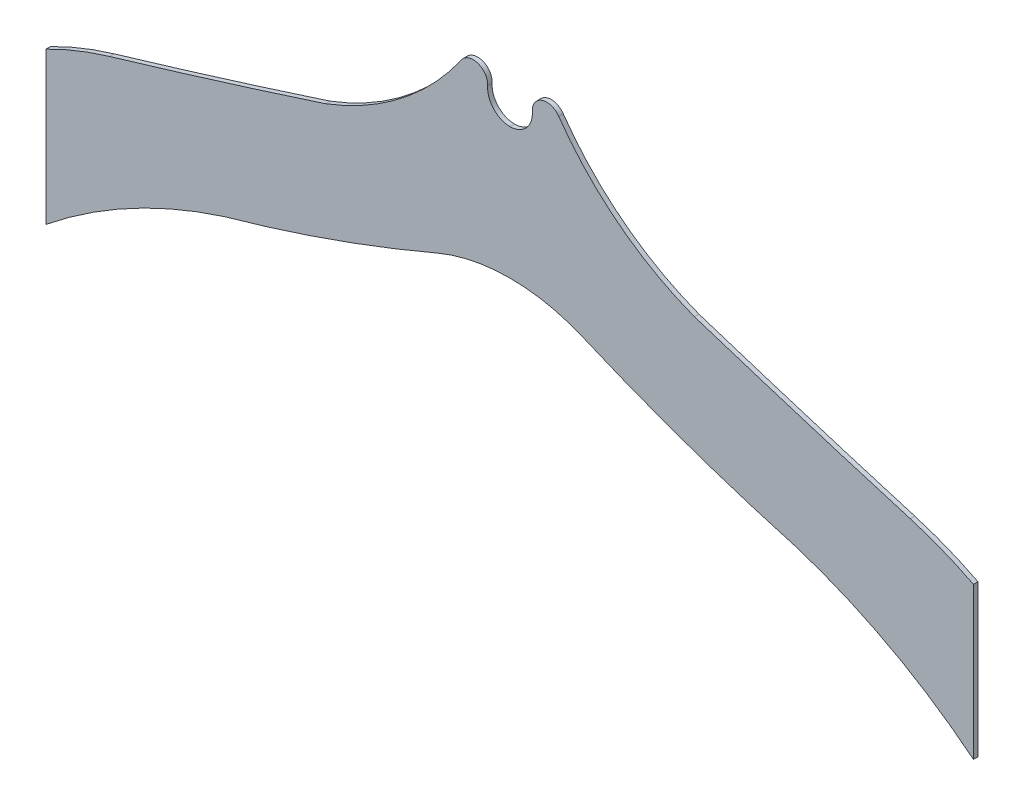
ISO-10303-21;
HEADER;
FILE_DESCRIPTION(('STEP AP214'),'2;1');
FILE_NAME('part.step','',(''),(''),'','','');
FILE_SCHEMA(('AUTOMOTIVE_DESIGN { 1 0 10303 214 1 1 1 1 }'));
ENDSEC;
DATA;
#1=APPLICATION_CONTEXT('core data for automotive mechanical design processes');
#2=APPLICATION_PROTOCOL_DEFINITION('international standard','automotive_design',2000,#1);
#3=PRODUCT_CONTEXT('',#1,'mechanical');
#4=PRODUCT('Part','Part','',(#3));
#5=PRODUCT_RELATED_PRODUCT_CATEGORY('part','',(#4));
#6=PRODUCT_DEFINITION_FORMATION('','',#4);
#7=PRODUCT_DEFINITION_CONTEXT('part definition',#1,'design');
#8=PRODUCT_DEFINITION('design','',#6,#7);
#9=PRODUCT_DEFINITION_SHAPE('','',#8);
#10=(LENGTH_UNIT() NAMED_UNIT(*) SI_UNIT(.MILLI.,.METRE.));
#11=(NAMED_UNIT(*) PLANE_ANGLE_UNIT() SI_UNIT($,.RADIAN.));
#12=(NAMED_UNIT(*) SI_UNIT($,.STERADIAN.) SOLID_ANGLE_UNIT());
#13=UNCERTAINTY_MEASURE_WITH_UNIT(LENGTH_MEASURE(1.E-05),#10,'distance_accuracy_value','');
#14=(GEOMETRIC_REPRESENTATION_CONTEXT(3) GLOBAL_UNCERTAINTY_ASSIGNED_CONTEXT((#13)) GLOBAL_UNIT_ASSIGNED_CONTEXT((#10,
#11,#12)) REPRESENTATION_CONTEXT('',''));
#15=CARTESIAN_POINT('',(0.,0.,0.));
#16=DIRECTION('',(0.,0.,1.));
#17=DIRECTION('',(1.,0.,0.));
#18=AXIS2_PLACEMENT_3D('',#15,#16,#17);
#19=CARTESIAN_POINT('',(-650.809500657787,926.892746035444,0.));
#20=DIRECTION('',(-1.,0.,0.));
#21=DIRECTION('',(0.,-1.,0.));
#22=AXIS2_PLACEMENT_3D('',#19,#20,#21);
#23=PLANE('',#22);
#24=DIRECTION('',(0.,-1.,0.));
#25=VECTOR('',#24,1.);
#26=CARTESIAN_POINT('',(-650.809500657786,-2255.82427941432,6.35));
#27=LINE('',#26,#25);
#28=CARTESIAN_POINT('',(-650.809500657786,-263.112443380629,6.35));
#29=VERTEX_POINT('',#28);
#30=CARTESIAN_POINT('',(-650.809500657786,-476.145226420373,6.35));
#31=VERTEX_POINT('',#30);
#32=EDGE_CURVE('E40',#29,#31,#27,.T.);
#33=ORIENTED_EDGE('',*,*,#32,.F.);
#34=DIRECTION('',(0.,0.,-1.));
#35=VECTOR('',#34,1.);
#36=CARTESIAN_POINT('',(-650.809500657786,-263.112443380629,6.35));
#37=LINE('',#36,#35);
#38=CARTESIAN_POINT('',(-650.809500657786,-263.112443380629,0.));
#39=VERTEX_POINT('',#38);
#40=EDGE_CURVE('E227',#29,#39,#37,.T.);
#41=ORIENTED_EDGE('',*,*,#40,.T.);
#42=DIRECTION('',(0.,-1.,0.));
#43=VECTOR('',#42,1.);
#44=CARTESIAN_POINT('',(-650.809500657786,-2255.82427941432,0.));
#45=LINE('',#44,#43);
#46=CARTESIAN_POINT('',(-650.809500657786,-476.145226420373,0.));
#47=VERTEX_POINT('',#46);
#48=EDGE_CURVE('E223',#39,#47,#45,.T.);
#49=ORIENTED_EDGE('',*,*,#48,.T.);
#50=DIRECTION('',(0.,0.,-1.));
#51=VECTOR('',#50,1.);
#52=CARTESIAN_POINT('',(-650.809500657786,-476.145226420373,6.35));
#53=LINE('',#52,#51);
#54=EDGE_CURVE('E230',#31,#47,#53,.T.);
#55=ORIENTED_EDGE('',*,*,#54,.F.);
#56=EDGE_LOOP('',(#33,#41,#49,#55));
#57=FACE_BOUND('',#56,.T.);
#58=ADVANCED_FACE('F36',(#57),#23,.T.);
#59=CARTESIAN_POINT('',(650.809500657787,926.892746035444,0.));
#60=DIRECTION('',(1.,0.,0.));
#61=DIRECTION('',(0.,-1.,0.));
#62=AXIS2_PLACEMENT_3D('',#59,#60,#61);
#63=PLANE('',#62);
#64=DIRECTION('',(0.,1.,0.));
#65=VECTOR('',#64,1.);
#66=CARTESIAN_POINT('',(650.809500657786,-2255.82427941432,0.));
#67=LINE('',#66,#65);
#68=CARTESIAN_POINT('',(650.809500657786,-475.62803001882,0.));
#69=VERTEX_POINT('',#68);
#70=CARTESIAN_POINT('',(650.809500657786,-262.784392892332,0.));
#71=VERTEX_POINT('',#70);
#72=EDGE_CURVE('E160',#69,#71,#67,.T.);
#73=ORIENTED_EDGE('',*,*,#72,.T.);
#74=DIRECTION('',(0.,0.,-1.));
#75=VECTOR('',#74,1.);
#76=CARTESIAN_POINT('',(650.809500657786,-262.784392892332,6.35));
#77=LINE('',#76,#75);
#78=CARTESIAN_POINT('',(650.809500657786,-262.784392892332,6.35));
#79=VERTEX_POINT('',#78);
#80=EDGE_CURVE('E224',#71,#79,#77,.F.);
#81=ORIENTED_EDGE('',*,*,#80,.T.);
#82=DIRECTION('',(0.,1.,0.));
#83=VECTOR('',#82,1.);
#84=CARTESIAN_POINT('',(650.809500657786,-2255.82427941432,6.35));
#85=LINE('',#84,#83);
#86=CARTESIAN_POINT('',(650.809500657786,-475.62803001882,6.35));
#87=VERTEX_POINT('',#86);
#88=EDGE_CURVE('E231',#87,#79,#85,.T.);
#89=ORIENTED_EDGE('',*,*,#88,.F.);
#90=DIRECTION('',(0.,0.,-1.));
#91=VECTOR('',#90,1.);
#92=CARTESIAN_POINT('',(650.809500657786,-475.62803001882,6.35));
#93=LINE('',#92,#91);
#94=EDGE_CURVE('E228',#69,#87,#93,.F.);
#95=ORIENTED_EDGE('',*,*,#94,.F.);
#96=EDGE_LOOP('',(#73,#81,#89,#95));
#97=FACE_BOUND('',#96,.T.);
#98=ADVANCED_FACE('F286',(#97),#63,.T.);
#99=CARTESIAN_POINT('',(-167.983659058844,-1073.95924229887,6.35));
#100=DIRECTION('',(0.,0.,-1.));
#101=DIRECTION('',(-1.,0.,0.));
#102=AXIS2_PLACEMENT_3D('',#99,#100,#101);
#103=CYLINDRICAL_SURFACE('',#102,768.441533817959);
#104=CARTESIAN_POINT('',(-167.983659058844,-1073.95924229887,6.35));
#105=DIRECTION('',(0.,0.,1.));
#106=DIRECTION('',(1.,0.,0.));
#107=AXIS2_PLACEMENT_3D('',#104,#105,#106);
#108=CIRCLE('',#107,768.441533817959);
#109=CARTESIAN_POINT('',(-400.266331752857,-341.465453340471,6.35));
#110=VERTEX_POINT('',#109);
#111=EDGE_CURVE('E208',#110,#31,#108,.T.);
#112=ORIENTED_EDGE('',*,*,#111,.T.);
#113=ORIENTED_EDGE('',*,*,#54,.T.);
#114=CARTESIAN_POINT('',(-167.983659058844,-1073.95924229887,0.));
#115=DIRECTION('',(0.,0.,1.));
#116=DIRECTION('',(1.,0.,0.));
#117=AXIS2_PLACEMENT_3D('',#114,#115,#116);
#118=CIRCLE('',#117,768.441533817959);
#119=CARTESIAN_POINT('',(-400.266331752857,-341.465453340471,0.));
#120=VERTEX_POINT('',#119);
#121=EDGE_CURVE('E164',#120,#47,#118,.T.);
#122=ORIENTED_EDGE('',*,*,#121,.F.);
#123=DIRECTION('',(0.,0.,-1.));
#124=VECTOR('',#123,1.);
#125=CARTESIAN_POINT('',(-400.266331752857,-341.465453340471,6.35));
#126=LINE('',#125,#124);
#127=EDGE_CURVE('E173',#110,#120,#126,.T.);
#128=ORIENTED_EDGE('',*,*,#127,.F.);
#129=EDGE_LOOP('',(#112,#113,#122,#128));
#130=FACE_BOUND('',#129,.T.);
#131=ADVANCED_FACE('F38',(#130),#103,.F.);
#132=CARTESIAN_POINT('',(-1045.63273530441,1969.29928635765,6.35));
#133=DIRECTION('',(0.,0.,-1.));
#134=DIRECTION('',(-1.,0.,0.));
#135=AXIS2_PLACEMENT_3D('',#132,#133,#134);
#136=CYLINDRICAL_SURFACE('',#135,2399.193922355);
#137=CARTESIAN_POINT('',(-1045.63273530441,1969.29928635765,0.));
#138=DIRECTION('',(0.,0.,1.));
#139=DIRECTION('',(1.,0.,0.));
#140=AXIS2_PLACEMENT_3D('',#137,#138,#139);
#141=CIRCLE('',#140,2399.193922355);
#142=CARTESIAN_POINT('',(-102.624962662433,-236.798584953143,0.));
#143=VERTEX_POINT('',#142);
#144=EDGE_CURVE('E179',#120,#143,#141,.T.);
#145=ORIENTED_EDGE('',*,*,#144,.T.);
#146=DIRECTION('',(0.,0.,-1.));
#147=VECTOR('',#146,1.);
#148=CARTESIAN_POINT('',(-102.624962662433,-236.798584953143,6.35));
#149=LINE('',#148,#147);
#150=CARTESIAN_POINT('',(-102.624962662433,-236.798584953143,6.35));
#151=VERTEX_POINT('',#150);
#152=EDGE_CURVE('E186',#151,#143,#149,.T.);
#153=ORIENTED_EDGE('',*,*,#152,.F.);
#154=CARTESIAN_POINT('',(-1045.63273530441,1969.29928635765,6.35));
#155=DIRECTION('',(0.,0.,1.));
#156=DIRECTION('',(1.,0.,0.));
#157=AXIS2_PLACEMENT_3D('',#154,#155,#156);
#158=CIRCLE('',#157,2399.193922355);
#159=EDGE_CURVE('E206',#110,#151,#158,.T.);
#160=ORIENTED_EDGE('',*,*,#159,.F.);
#161=ORIENTED_EDGE('',*,*,#127,.T.);
#162=EDGE_LOOP('',(#145,#153,#160,#161));
#163=FACE_BOUND('',#162,.T.);
#164=ADVANCED_FACE('F273',(#163),#136,.T.);
#165=CARTESIAN_POINT('',(-0.149571003863258,-476.53228594708,6.35));
#166=DIRECTION('',(0.,0.,-1.));
#167=DIRECTION('',(-1.,0.,0.));
#168=AXIS2_PLACEMENT_3D('',#165,#166,#167);
#169=CYLINDRICAL_SURFACE('',#168,260.717190242277);
#170=CARTESIAN_POINT('',(-0.149571003863258,-476.53228594708,0.));
#171=DIRECTION('',(0.,0.,1.));
#172=DIRECTION('',(1.,0.,0.));
#173=AXIS2_PLACEMENT_3D('',#170,#171,#172);
#174=CIRCLE('',#173,260.717190242277);
#175=CARTESIAN_POINT('',(0.320536376268185,-215.815519537862,0.));
#176=VERTEX_POINT('',#175);
#177=EDGE_CURVE('E11',#176,#143,#174,.T.);
#178=ORIENTED_EDGE('',*,*,#177,.F.);
#179=DIRECTION('',(0.,0.,-1.));
#180=VECTOR('',#179,1.);
#181=CARTESIAN_POINT('',(0.320536376268185,-215.815519537862,6.35));
#182=LINE('',#181,#180);
#183=CARTESIAN_POINT('',(0.320536376268185,-215.815519537862,6.35));
#184=VERTEX_POINT('',#183);
#185=EDGE_CURVE('E55',#184,#176,#182,.T.);
#186=ORIENTED_EDGE('',*,*,#185,.F.);
#187=CARTESIAN_POINT('',(-0.149571003863258,-476.53228594708,6.35));
#188=DIRECTION('',(0.,0.,1.));
#189=DIRECTION('',(1.,0.,0.));
#190=AXIS2_PLACEMENT_3D('',#187,#188,#189);
#191=CIRCLE('',#190,260.717190242277);
#192=EDGE_CURVE('E213',#184,#151,#191,.T.);
#193=ORIENTED_EDGE('',*,*,#192,.T.);
#194=ORIENTED_EDGE('',*,*,#152,.T.);
#195=EDGE_LOOP('',(#178,#186,#193,#194));
#196=FACE_BOUND('',#195,.T.);
#197=ADVANCED_FACE('F277',(#196),#169,.F.);
#198=CARTESIAN_POINT('',(0.790643755851583,-476.53228594708,6.35));
#199=DIRECTION('',(0.,0.,-1.));
#200=DIRECTION('',(-1.,0.,0.));
#201=AXIS2_PLACEMENT_3D('',#198,#199,#200);
#202=CYLINDRICAL_SURFACE('',#201,260.717190242276);
#203=CARTESIAN_POINT('',(0.790643755851583,-476.53228594708,0.));
#204=DIRECTION('',(0.,0.,1.));
#205=DIRECTION('',(1.,0.,0.));
#206=AXIS2_PLACEMENT_3D('',#203,#204,#205);
#207=CIRCLE('',#206,260.717190242276);
#208=CARTESIAN_POINT('',(103.266035414418,-236.798584953142,0.));
#209=VERTEX_POINT('',#208);
#210=EDGE_CURVE('E46',#209,#176,#207,.T.);
#211=ORIENTED_EDGE('',*,*,#210,.F.);
#212=DIRECTION('',(0.,0.,-1.));
#213=VECTOR('',#212,1.);
#214=CARTESIAN_POINT('',(103.266035414418,-236.798584953142,6.35));
#215=LINE('',#214,#213);
#216=CARTESIAN_POINT('',(103.266035414418,-236.798584953142,6.35));
#217=VERTEX_POINT('',#216);
#218=EDGE_CURVE('E100',#217,#209,#215,.T.);
#219=ORIENTED_EDGE('',*,*,#218,.F.);
#220=CARTESIAN_POINT('',(0.790643755851583,-476.53228594708,6.35));
#221=DIRECTION('',(0.,0.,1.));
#222=DIRECTION('',(1.,0.,0.));
#223=AXIS2_PLACEMENT_3D('',#220,#221,#222);
#224=CIRCLE('',#223,260.717190242276);
#225=EDGE_CURVE('E211',#217,#184,#224,.T.);
#226=ORIENTED_EDGE('',*,*,#225,.T.);
#227=ORIENTED_EDGE('',*,*,#185,.T.);
#228=EDGE_LOOP('',(#211,#219,#226,#227));
#229=FACE_BOUND('',#228,.T.);
#230=ADVANCED_FACE('F275',(#229),#202,.F.);
#231=CARTESIAN_POINT('',(1046.2738080564,1969.29928635765,6.35));
#232=DIRECTION('',(0.,0.,-1.));
#233=DIRECTION('',(-1.,0.,0.));
#234=AXIS2_PLACEMENT_3D('',#231,#232,#233);
#235=CYLINDRICAL_SURFACE('',#234,2399.193922355);
#236=CARTESIAN_POINT('',(1046.2738080564,1969.29928635765,0.));
#237=DIRECTION('',(0.,0.,1.));
#238=DIRECTION('',(1.,0.,0.));
#239=AXIS2_PLACEMENT_3D('',#236,#237,#238);
#240=CIRCLE('',#239,2399.193922355);
#241=CARTESIAN_POINT('',(400.907404504846,-341.465453340472,0.));
#242=VERTEX_POINT('',#241);
#243=EDGE_CURVE('E156',#209,#242,#240,.T.);
#244=ORIENTED_EDGE('',*,*,#243,.T.);
#245=DIRECTION('',(0.,0.,-1.));
#246=VECTOR('',#245,1.);
#247=CARTESIAN_POINT('',(400.907404504846,-341.465453340472,6.35));
#248=LINE('',#247,#246);
#249=CARTESIAN_POINT('',(400.907404504846,-341.465453340472,6.35));
#250=VERTEX_POINT('',#249);
#251=EDGE_CURVE('E167',#250,#242,#248,.T.);
#252=ORIENTED_EDGE('',*,*,#251,.F.);
#253=CARTESIAN_POINT('',(1046.2738080564,1969.29928635765,6.35));
#254=DIRECTION('',(0.,0.,1.));
#255=DIRECTION('',(1.,0.,0.));
#256=AXIS2_PLACEMENT_3D('',#253,#254,#255);
#257=CIRCLE('',#256,2399.193922355);
#258=EDGE_CURVE('E209',#217,#250,#257,.T.);
#259=ORIENTED_EDGE('',*,*,#258,.F.);
#260=ORIENTED_EDGE('',*,*,#218,.T.);
#261=EDGE_LOOP('',(#244,#252,#259,#260));
#262=FACE_BOUND('',#261,.T.);
#263=ADVANCED_FACE('F175',(#262),#235,.T.);
#264=CARTESIAN_POINT('',(168.624731810823,-1073.95924229889,6.35));
#265=DIRECTION('',(0.,0.,-1.));
#266=DIRECTION('',(-1.,0.,0.));
#267=AXIS2_PLACEMENT_3D('',#264,#265,#266);
#268=CYLINDRICAL_SURFACE('',#267,768.441533817988);
#269=CARTESIAN_POINT('',(168.624731810823,-1073.95924229889,0.));
#270=DIRECTION('',(0.,0.,1.));
#271=DIRECTION('',(1.,0.,0.));
#272=AXIS2_PLACEMENT_3D('',#269,#270,#271);
#273=CIRCLE('',#272,768.441533817988);
#274=EDGE_CURVE('E150',#69,#242,#273,.T.);
#275=ORIENTED_EDGE('',*,*,#274,.F.);
#276=ORIENTED_EDGE('',*,*,#94,.T.);
#277=CARTESIAN_POINT('',(168.624731810823,-1073.95924229889,6.35));
#278=DIRECTION('',(0.,0.,1.));
#279=DIRECTION('',(1.,0.,0.));
#280=AXIS2_PLACEMENT_3D('',#277,#278,#279);
#281=CIRCLE('',#280,768.441533817988);
#282=EDGE_CURVE('E170',#87,#250,#281,.T.);
#283=ORIENTED_EDGE('',*,*,#282,.T.);
#284=ORIENTED_EDGE('',*,*,#251,.T.);
#285=EDGE_LOOP('',(#275,#276,#283,#284));
#286=FACE_BOUND('',#285,.T.);
#287=ADVANCED_FACE('F168',(#286),#268,.F.);
#288=CARTESIAN_POINT('',(414.826564638267,-724.730132721026,6.35));
#289=DIRECTION('',(0.,0.,-1.));
#290=DIRECTION('',(-1.,0.,0.));
#291=AXIS2_PLACEMENT_3D('',#288,#289,#290);
#292=CYLINDRICAL_SURFACE('',#291,518.730963639411);
#293=ORIENTED_EDGE('',*,*,#80,.F.);
#294=CARTESIAN_POINT('',(414.826564638267,-724.730132721026,0.));
#295=DIRECTION('',(0.,0.,1.));
#296=DIRECTION('',(1.,0.,0.));
#297=AXIS2_PLACEMENT_3D('',#294,#295,#296);
#298=CIRCLE('',#297,518.730963639411);
#299=CARTESIAN_POINT('',(562.153765563842,-227.360543275122,0.));
#300=VERTEX_POINT('',#299);
#301=EDGE_CURVE('E216',#71,#300,#298,.T.);
#302=ORIENTED_EDGE('',*,*,#301,.T.);
#303=DIRECTION('',(0.,0.,-1.));
#304=VECTOR('',#303,1.);
#305=CARTESIAN_POINT('',(562.153765563842,-227.360543275122,6.35));
#306=LINE('',#305,#304);
#307=CARTESIAN_POINT('',(562.153765563842,-227.360543275122,6.35));
#308=VERTEX_POINT('',#307);
#309=EDGE_CURVE('E340',#308,#300,#306,.T.);
#310=ORIENTED_EDGE('',*,*,#309,.F.);
#311=CARTESIAN_POINT('',(414.826564638267,-724.730132721026,6.35));
#312=DIRECTION('',(0.,0.,1.));
#313=DIRECTION('',(1.,0.,0.));
#314=AXIS2_PLACEMENT_3D('',#311,#312,#313);
#315=CIRCLE('',#314,518.730963639411);
#316=EDGE_CURVE('E194',#79,#308,#315,.T.);
#317=ORIENTED_EDGE('',*,*,#316,.F.);
#318=EDGE_LOOP('',(#293,#302,#310,#317));
#319=FACE_BOUND('',#318,.T.);
#320=ADVANCED_FACE('F302',(#319),#292,.T.);
#321=CARTESIAN_POINT('',(4031.34256912054,11484.4550623153,6.35));
#322=DIRECTION('',(0.,0.,-1.));
#323=DIRECTION('',(-1.,0.,0.));
#324=AXIS2_PLACEMENT_3D('',#321,#322,#323);
#325=CYLINDRICAL_SURFACE('',#324,12214.8227876656);
#326=CARTESIAN_POINT('',(4031.34256912054,11484.4550623153,0.));
#327=DIRECTION('',(0.,0.,1.));
#328=DIRECTION('',(1.,0.,0.));
#329=AXIS2_PLACEMENT_3D('',#326,#327,#328);
#330=CIRCLE('',#329,12214.8227876656);
#331=CARTESIAN_POINT('',(259.188876671049,-133.322360867481,0.));
#332=VERTEX_POINT('',#331);
#333=EDGE_CURVE('E219',#332,#300,#330,.T.);
#334=ORIENTED_EDGE('',*,*,#333,.F.);
#335=DIRECTION('',(0.,0.,-1.));
#336=VECTOR('',#335,1.);
#337=CARTESIAN_POINT('',(259.188876671049,-133.322360867481,6.35));
#338=LINE('',#337,#336);
#339=CARTESIAN_POINT('',(259.188876671049,-133.322360867481,6.35));
#340=VERTEX_POINT('',#339);
#341=EDGE_CURVE('E344',#340,#332,#338,.T.);
#342=ORIENTED_EDGE('',*,*,#341,.F.);
#343=CARTESIAN_POINT('',(4031.34256912054,11484.4550623153,6.35));
#344=DIRECTION('',(0.,0.,1.));
#345=DIRECTION('',(1.,0.,0.));
#346=AXIS2_PLACEMENT_3D('',#343,#344,#345);
#347=CIRCLE('',#346,12214.8227876656);
#348=EDGE_CURVE('E191',#340,#308,#347,.T.);
#349=ORIENTED_EDGE('',*,*,#348,.T.);
#350=ORIENTED_EDGE('',*,*,#309,.T.);
#351=EDGE_LOOP('',(#334,#342,#349,#350));
#352=FACE_BOUND('',#351,.T.);
#353=ADVANCED_FACE('F305',(#352),#325,.F.);
#354=CARTESIAN_POINT('',(403.974458011753,249.010582615593,6.35));
#355=DIRECTION('',(0.,0.,-1.));
#356=DIRECTION('',(-1.,0.,0.));
#357=AXIS2_PLACEMENT_3D('',#354,#355,#356);
#358=CYLINDRICAL_SURFACE('',#357,408.829236034554);
#359=CARTESIAN_POINT('',(403.974458011753,249.010582615593,0.));
#360=DIRECTION('',(0.,0.,1.));
#361=DIRECTION('',(1.,0.,0.));
#362=AXIS2_PLACEMENT_3D('',#359,#360,#361);
#363=CIRCLE('',#362,408.829236034554);
#364=CARTESIAN_POINT('',(68.616510616902,15.1807484290424,0.));
#365=VERTEX_POINT('',#364);
#366=EDGE_CURVE('E354',#365,#332,#363,.T.);
#367=ORIENTED_EDGE('',*,*,#366,.F.);
#368=DIRECTION('',(0.,0.,-1.));
#369=VECTOR('',#368,1.);
#370=CARTESIAN_POINT('',(68.616510616902,15.1807484290424,6.35));
#371=LINE('',#370,#369);
#372=CARTESIAN_POINT('',(68.616510616902,15.1807484290424,6.35));
#373=VERTEX_POINT('',#372);
#374=EDGE_CURVE('E351',#373,#365,#371,.T.);
#375=ORIENTED_EDGE('',*,*,#374,.F.);
#376=CARTESIAN_POINT('',(403.974458011753,249.010582615593,6.35));
#377=DIRECTION('',(0.,0.,1.));
#378=DIRECTION('',(1.,0.,0.));
#379=AXIS2_PLACEMENT_3D('',#376,#377,#378);
#380=CIRCLE('',#379,408.829236034554);
#381=EDGE_CURVE('E188',#373,#340,#380,.T.);
#382=ORIENTED_EDGE('',*,*,#381,.T.);
#383=ORIENTED_EDGE('',*,*,#341,.T.);
#384=EDGE_LOOP('',(#367,#375,#382,#383));
#385=FACE_BOUND('',#384,.T.);
#386=ADVANCED_FACE('F350',(#385),#358,.F.);
#387=CARTESIAN_POINT('',(51.9482469743568,3.55872678291647,6.35));
#388=DIRECTION('',(0.,0.,-1.));
#389=DIRECTION('',(-1.,0.,0.));
#390=AXIS2_PLACEMENT_3D('',#387,#388,#389);
#391=CYLINDRICAL_SURFACE('',#390,20.3200000000006);
#392=CARTESIAN_POINT('',(51.9482469743568,3.55872678291647,0.));
#393=DIRECTION('',(0.,0.,1.));
#394=DIRECTION('',(1.,0.,0.));
#395=AXIS2_PLACEMENT_3D('',#392,#393,#394);
#396=CIRCLE('',#395,20.3200000000006);
#397=CARTESIAN_POINT('',(31.6757603503167,2.1699553554484,0.));
#398=VERTEX_POINT('',#397);
#399=EDGE_CURVE('E389',#365,#398,#396,.T.);
#400=ORIENTED_EDGE('',*,*,#399,.T.);
#401=DIRECTION('',(0.,0.,-1.));
#402=VECTOR('',#401,1.);
#403=CARTESIAN_POINT('',(31.6757603503167,2.1699553554484,6.35));
#404=LINE('',#403,#402);
#405=CARTESIAN_POINT('',(31.6757603503167,2.1699553554484,6.35));
#406=VERTEX_POINT('',#405);
#407=EDGE_CURVE('E358',#406,#398,#404,.T.);
#408=ORIENTED_EDGE('',*,*,#407,.F.);
#409=CARTESIAN_POINT('',(51.9482469743568,3.55872678291647,6.35));
#410=DIRECTION('',(0.,0.,1.));
#411=DIRECTION('',(1.,0.,0.));
#412=AXIS2_PLACEMENT_3D('',#409,#410,#411);
#413=CIRCLE('',#412,20.3200000000006);
#414=EDGE_CURVE('E185',#373,#406,#413,.T.);
#415=ORIENTED_EDGE('',*,*,#414,.F.);
#416=ORIENTED_EDGE('',*,*,#374,.T.);
#417=EDGE_LOOP('',(#400,#408,#415,#416));
#418=FACE_BOUND('',#417,.T.);
#419=ADVANCED_FACE('F361',(#418),#391,.T.);
#420=CARTESIAN_POINT('',(0.,0.,6.35));
#421=DIRECTION('',(0.,0.,-1.));
#422=DIRECTION('',(-1.,0.,0.));
#423=AXIS2_PLACEMENT_3D('',#420,#421,#422);
#424=CYLINDRICAL_SURFACE('',#423,31.7500000002415);
#425=CARTESIAN_POINT('',(0.,0.,0.));
#426=DIRECTION('',(0.,0.,1.));
#427=DIRECTION('',(1.,0.,0.));
#428=AXIS2_PLACEMENT_3D('',#425,#426,#427);
#429=CIRCLE('',#428,31.7500000002415);
#430=CARTESIAN_POINT('',(0.320536375143708,-31.7483819500702,0.));
#431=VERTEX_POINT('',#430);
#432=EDGE_CURVE('E214',#431,#398,#429,.T.);
#433=ORIENTED_EDGE('',*,*,#432,.F.);
#434=DIRECTION('',(0.,0.,-1.));
#435=VECTOR('',#434,1.);
#436=CARTESIAN_POINT('',(0.320536375143708,-31.7483819500702,6.35));
#437=LINE('',#436,#435);
#438=CARTESIAN_POINT('',(0.320536375143708,-31.7483819500702,6.35));
#439=VERTEX_POINT('',#438);
#440=EDGE_CURVE('E112',#439,#431,#437,.T.);
#441=ORIENTED_EDGE('',*,*,#440,.F.);
#442=CARTESIAN_POINT('',(0.,0.,6.35));
#443=DIRECTION('',(0.,0.,1.));
#444=DIRECTION('',(1.,0.,0.));
#445=AXIS2_PLACEMENT_3D('',#442,#443,#444);
#446=CIRCLE('',#445,31.7500000002415);
#447=EDGE_CURVE('E182',#439,#406,#446,.T.);
#448=ORIENTED_EDGE('',*,*,#447,.T.);
#449=ORIENTED_EDGE('',*,*,#407,.T.);
#450=EDGE_LOOP('',(#433,#441,#448,#449));
#451=FACE_BOUND('',#450,.T.);
#452=ADVANCED_FACE('F300',(#451),#424,.F.);
#453=CARTESIAN_POINT('',(0.641072750314109,0.,6.35));
#454=DIRECTION('',(0.,0.,-1.));
#455=DIRECTION('',(-1.,0.,0.));
#456=AXIS2_PLACEMENT_3D('',#453,#454,#455);
#457=CYLINDRICAL_SURFACE('',#456,31.7500000002431);
#458=CARTESIAN_POINT('',(0.641072750314109,0.,0.));
#459=DIRECTION('',(0.,0.,1.));
#460=DIRECTION('',(1.,0.,0.));
#461=AXIS2_PLACEMENT_3D('',#458,#459,#460);
#462=CIRCLE('',#461,31.7500000002431);
#463=CARTESIAN_POINT('',(-31.034687600004,2.16995535545185,0.));
#464=VERTEX_POINT('',#463);
#465=EDGE_CURVE('E370',#464,#431,#462,.T.);
#466=ORIENTED_EDGE('',*,*,#465,.F.);
#467=DIRECTION('',(0.,0.,-1.));
#468=VECTOR('',#467,1.);
#469=CARTESIAN_POINT('',(-31.034687600004,2.16995535545185,6.35));
#470=LINE('',#469,#468);
#471=CARTESIAN_POINT('',(-31.034687600004,2.16995535545185,6.35));
#472=VERTEX_POINT('',#471);
#473=EDGE_CURVE('E235',#472,#464,#470,.T.);
#474=ORIENTED_EDGE('',*,*,#473,.F.);
#475=CARTESIAN_POINT('',(0.641072750314109,0.,6.35));
#476=DIRECTION('',(0.,0.,1.));
#477=DIRECTION('',(1.,0.,0.));
#478=AXIS2_PLACEMENT_3D('',#475,#476,#477);
#479=CIRCLE('',#478,31.7500000002431);
#480=EDGE_CURVE('E204',#472,#439,#479,.T.);
#481=ORIENTED_EDGE('',*,*,#480,.T.);
#482=ORIENTED_EDGE('',*,*,#440,.T.);
#483=EDGE_LOOP('',(#466,#474,#481,#482));
#484=FACE_BOUND('',#483,.T.);
#485=ADVANCED_FACE('F368',(#484),#457,.F.);
#486=CARTESIAN_POINT('',(-51.3071742240454,3.55872678291647,6.35));
#487=DIRECTION('',(0.,0.,-1.));
#488=DIRECTION('',(-1.,0.,0.));
#489=AXIS2_PLACEMENT_3D('',#486,#487,#488);
#490=CYLINDRICAL_SURFACE('',#489,20.3200000000003);
#491=CARTESIAN_POINT('',(-51.3071742240454,3.55872678291647,0.));
#492=DIRECTION('',(0.,0.,1.));
#493=DIRECTION('',(1.,0.,0.));
#494=AXIS2_PLACEMENT_3D('',#491,#492,#493);
#495=CIRCLE('',#494,20.3200000000003);
#496=CARTESIAN_POINT('',(-67.9754378665916,15.1807484290405,0.));
#497=VERTEX_POINT('',#496);
#498=EDGE_CURVE('E397',#464,#497,#495,.T.);
#499=ORIENTED_EDGE('',*,*,#498,.T.);
#500=DIRECTION('',(0.,0.,-1.));
#501=VECTOR('',#500,1.);
#502=CARTESIAN_POINT('',(-67.9754378665916,15.1807484290405,6.35));
#503=LINE('',#502,#501);
#504=CARTESIAN_POINT('',(-67.9754378665916,15.1807484290405,6.35));
#505=VERTEX_POINT('',#504);
#506=EDGE_CURVE('E374',#505,#497,#503,.T.);
#507=ORIENTED_EDGE('',*,*,#506,.F.);
#508=CARTESIAN_POINT('',(-51.3071742240454,3.55872678291647,6.35));
#509=DIRECTION('',(0.,0.,1.));
#510=DIRECTION('',(1.,0.,0.));
#511=AXIS2_PLACEMENT_3D('',#508,#509,#510);
#512=CIRCLE('',#511,20.3200000000003);
#513=EDGE_CURVE('E202',#472,#505,#512,.T.);
#514=ORIENTED_EDGE('',*,*,#513,.F.);
#515=ORIENTED_EDGE('',*,*,#473,.T.);
#516=EDGE_LOOP('',(#499,#507,#514,#515));
#517=FACE_BOUND('',#516,.T.);
#518=ADVANCED_FACE('F377',(#517),#490,.T.);
#519=CARTESIAN_POINT('',(-403.33338526144,249.010582615593,6.35));
#520=DIRECTION('',(0.,0.,-1.));
#521=DIRECTION('',(-1.,0.,0.));
#522=AXIS2_PLACEMENT_3D('',#519,#520,#521);
#523=CYLINDRICAL_SURFACE('',#522,408.829236034554);
#524=CARTESIAN_POINT('',(-403.33338526144,249.010582615593,0.));
#525=DIRECTION('',(0.,0.,1.));
#526=DIRECTION('',(1.,0.,0.));
#527=AXIS2_PLACEMENT_3D('',#524,#525,#526);
#528=CIRCLE('',#527,408.829236034554);
#529=CARTESIAN_POINT('',(-258.547803920739,-133.322360867482,0.));
#530=VERTEX_POINT('',#529);
#531=EDGE_CURVE('E394',#530,#497,#528,.T.);
#532=ORIENTED_EDGE('',*,*,#531,.F.);
#533=DIRECTION('',(0.,0.,-1.));
#534=VECTOR('',#533,1.);
#535=CARTESIAN_POINT('',(-258.547803920739,-133.322360867482,6.35));
#536=LINE('',#535,#534);
#537=CARTESIAN_POINT('',(-258.547803920739,-133.322360867482,6.35));
#538=VERTEX_POINT('',#537);
#539=EDGE_CURVE('E380',#538,#530,#536,.T.);
#540=ORIENTED_EDGE('',*,*,#539,.F.);
#541=CARTESIAN_POINT('',(-403.33338526144,249.010582615593,6.35));
#542=DIRECTION('',(0.,0.,1.));
#543=DIRECTION('',(1.,0.,0.));
#544=AXIS2_PLACEMENT_3D('',#541,#542,#543);
#545=CIRCLE('',#544,408.829236034554);
#546=EDGE_CURVE('E198',#538,#505,#545,.T.);
#547=ORIENTED_EDGE('',*,*,#546,.T.);
#548=ORIENTED_EDGE('',*,*,#506,.T.);
#549=EDGE_LOOP('',(#532,#540,#547,#548));
#550=FACE_BOUND('',#549,.T.);
#551=ADVANCED_FACE('F319',(#550),#523,.F.);
#552=CARTESIAN_POINT('',(-4030.70149637023,11484.4550623153,6.35));
#553=DIRECTION('',(0.,0.,-1.));
#554=DIRECTION('',(-1.,0.,0.));
#555=AXIS2_PLACEMENT_3D('',#552,#553,#554);
#556=CYLINDRICAL_SURFACE('',#555,12214.8227876656);
#557=CARTESIAN_POINT('',(-4030.70149637023,11484.4550623153,0.));
#558=DIRECTION('',(0.,0.,1.));
#559=DIRECTION('',(1.,0.,0.));
#560=AXIS2_PLACEMENT_3D('',#557,#558,#559);
#561=CIRCLE('',#560,12214.8227876656);
#562=CARTESIAN_POINT('',(-561.512692813565,-227.360543275132,0.));
#563=VERTEX_POINT('',#562);
#564=EDGE_CURVE('E240',#563,#530,#561,.T.);
#565=ORIENTED_EDGE('',*,*,#564,.F.);
#566=DIRECTION('',(0.,0.,-1.));
#567=VECTOR('',#566,1.);
#568=CARTESIAN_POINT('',(-561.512692813565,-227.360543275132,6.35));
#569=LINE('',#568,#567);
#570=CARTESIAN_POINT('',(-561.512692813565,-227.360543275132,6.35));
#571=VERTEX_POINT('',#570);
#572=EDGE_CURVE('E345',#571,#563,#569,.T.);
#573=ORIENTED_EDGE('',*,*,#572,.F.);
#574=CARTESIAN_POINT('',(-4030.70149637023,11484.4550623153,6.35));
#575=DIRECTION('',(0.,0.,1.));
#576=DIRECTION('',(1.,0.,0.));
#577=AXIS2_PLACEMENT_3D('',#574,#575,#576);
#578=CIRCLE('',#577,12214.8227876656);
#579=EDGE_CURVE('E195',#571,#538,#578,.T.);
#580=ORIENTED_EDGE('',*,*,#579,.T.);
#581=ORIENTED_EDGE('',*,*,#539,.T.);
#582=EDGE_LOOP('',(#565,#573,#580,#581));
#583=FACE_BOUND('',#582,.T.);
#584=ADVANCED_FACE('F314',(#583),#556,.F.);
#585=CARTESIAN_POINT('',(-414.185491887955,-724.730132721026,6.35));
#586=DIRECTION('',(0.,0.,-1.));
#587=DIRECTION('',(-1.,0.,0.));
#588=AXIS2_PLACEMENT_3D('',#585,#586,#587);
#589=CYLINDRICAL_SURFACE('',#588,518.730963639412);
#590=ORIENTED_EDGE('',*,*,#40,.F.);
#591=CARTESIAN_POINT('',(-414.185491887955,-724.730132721026,6.35));
#592=DIRECTION('',(0.,0.,1.));
#593=DIRECTION('',(1.,0.,0.));
#594=AXIS2_PLACEMENT_3D('',#591,#592,#593);
#595=CIRCLE('',#594,518.730963639412);
#596=EDGE_CURVE('E199',#571,#29,#595,.T.);
#597=ORIENTED_EDGE('',*,*,#596,.F.);
#598=ORIENTED_EDGE('',*,*,#572,.T.);
#599=CARTESIAN_POINT('',(-414.185491887955,-724.730132721026,0.));
#600=DIRECTION('',(0.,0.,1.));
#601=DIRECTION('',(1.,0.,0.));
#602=AXIS2_PLACEMENT_3D('',#599,#600,#601);
#603=CIRCLE('',#602,518.730963639412);
#604=EDGE_CURVE('E218',#563,#39,#603,.T.);
#605=ORIENTED_EDGE('',*,*,#604,.T.);
#606=EDGE_LOOP('',(#590,#597,#598,#605));
#607=FACE_BOUND('',#606,.T.);
#608=ADVANCED_FACE('F312',(#607),#589,.T.);
#609=CARTESIAN_POINT('',(203.810506836863,-2255.82427941432,0.));
#610=DIRECTION('',(0.,0.,1.));
#611=DIRECTION('',(1.,0.,0.));
#612=AXIS2_PLACEMENT_3D('',#609,#610,#611);
#613=PLANE('',#612);
#614=ORIENTED_EDGE('',*,*,#48,.F.);
#615=ORIENTED_EDGE('',*,*,#604,.F.);
#616=ORIENTED_EDGE('',*,*,#564,.T.);
#617=ORIENTED_EDGE('',*,*,#531,.T.);
#618=ORIENTED_EDGE('',*,*,#498,.F.);
#619=ORIENTED_EDGE('',*,*,#465,.T.);
#620=ORIENTED_EDGE('',*,*,#432,.T.);
#621=ORIENTED_EDGE('',*,*,#399,.F.);
#622=ORIENTED_EDGE('',*,*,#366,.T.);
#623=ORIENTED_EDGE('',*,*,#333,.T.);
#624=ORIENTED_EDGE('',*,*,#301,.F.);
#625=ORIENTED_EDGE('',*,*,#72,.F.);
#626=ORIENTED_EDGE('',*,*,#274,.T.);
#627=ORIENTED_EDGE('',*,*,#243,.F.);
#628=ORIENTED_EDGE('',*,*,#210,.T.);
#629=ORIENTED_EDGE('',*,*,#177,.T.);
#630=ORIENTED_EDGE('',*,*,#144,.F.);
#631=ORIENTED_EDGE('',*,*,#121,.T.);
#632=EDGE_LOOP('',(#614,#615,#616,#617,#618,#619,#620,#621,#622,#623,#624,#625,#626,#627,#628,
#629,#630,#631));
#633=FACE_BOUND('',#632,.T.);
#634=ADVANCED_FACE('F153',(#633),#613,.F.);
#635=CARTESIAN_POINT('',(203.810506836863,-2255.82427941432,6.35));
#636=DIRECTION('',(0.,0.,1.));
#637=DIRECTION('',(1.,0.,0.));
#638=AXIS2_PLACEMENT_3D('',#635,#636,#637);
#639=PLANE('',#638);
#640=ORIENTED_EDGE('',*,*,#596,.T.);
#641=ORIENTED_EDGE('',*,*,#32,.T.);
#642=ORIENTED_EDGE('',*,*,#111,.F.);
#643=ORIENTED_EDGE('',*,*,#159,.T.);
#644=ORIENTED_EDGE('',*,*,#192,.F.);
#645=ORIENTED_EDGE('',*,*,#225,.F.);
#646=ORIENTED_EDGE('',*,*,#258,.T.);
#647=ORIENTED_EDGE('',*,*,#282,.F.);
#648=ORIENTED_EDGE('',*,*,#88,.T.);
#649=ORIENTED_EDGE('',*,*,#316,.T.);
#650=ORIENTED_EDGE('',*,*,#348,.F.);
#651=ORIENTED_EDGE('',*,*,#381,.F.);
#652=ORIENTED_EDGE('',*,*,#414,.T.);
#653=ORIENTED_EDGE('',*,*,#447,.F.);
#654=ORIENTED_EDGE('',*,*,#480,.F.);
#655=ORIENTED_EDGE('',*,*,#513,.T.);
#656=ORIENTED_EDGE('',*,*,#546,.F.);
#657=ORIENTED_EDGE('',*,*,#579,.F.);
#658=EDGE_LOOP('',(#640,#641,#642,#643,#644,#645,#646,#647,#648,#649,#650,#651,#652,#653,#654,
#655,#656,#657));
#659=FACE_BOUND('',#658,.T.);
#660=ADVANCED_FACE('F261',(#659),#639,.T.);
#661=CLOSED_SHELL('',(#58,#98,#131,#164,#197,#230,#263,#287,#320,#353,#386,#419,#452,#485,#518,
#551,#584,#608,#634,#660));
#662=MANIFOLD_SOLID_BREP('B2',#661);
#663=ADVANCED_BREP_SHAPE_REPRESENTATION('',(#18,#662),#14);
#664=SHAPE_DEFINITION_REPRESENTATION(#9,#663);
ENDSEC;
END-ISO-10303-21;
